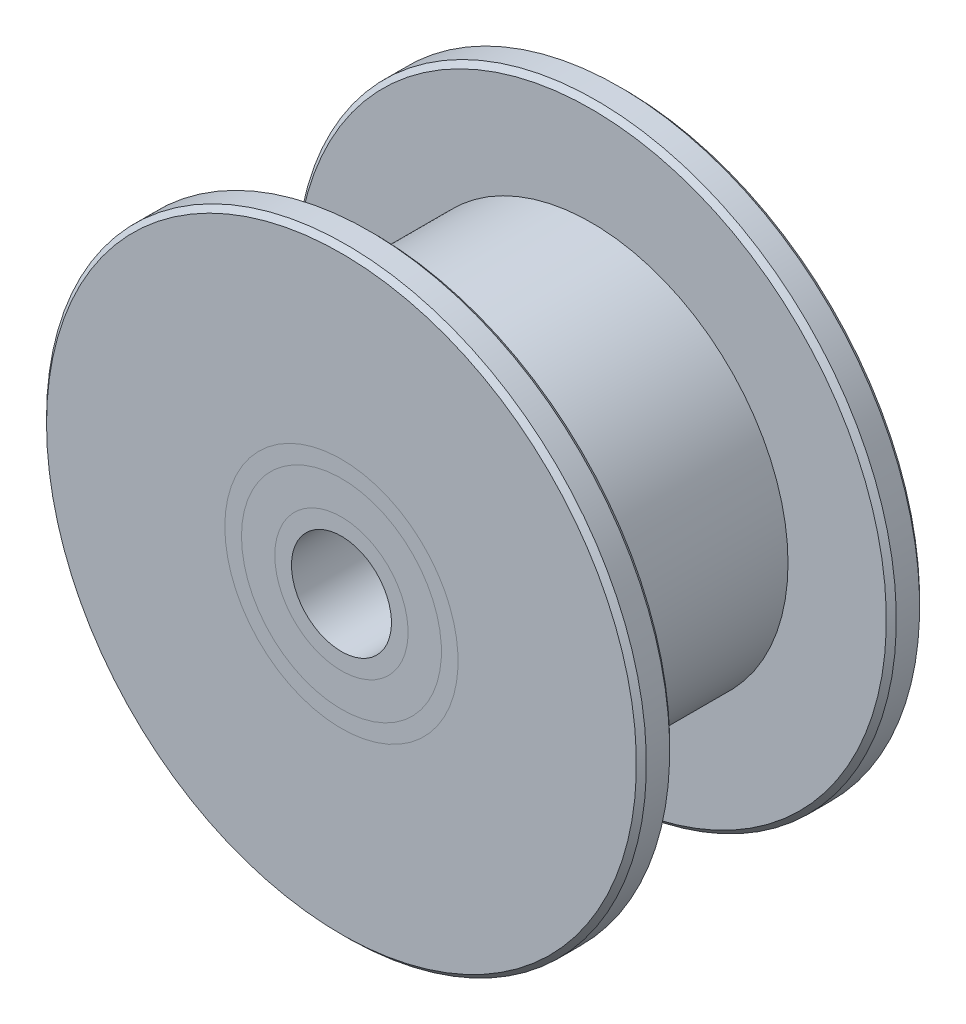
ISO-10303-21;
HEADER;
FILE_DESCRIPTION(('STEP AP214'),'2;1');
FILE_NAME('part.step','',(''),(''),'','','');
FILE_SCHEMA(('AUTOMOTIVE_DESIGN { 1 0 10303 214 1 1 1 1 }'));
ENDSEC;
DATA;
#1=APPLICATION_CONTEXT('core data for automotive mechanical design processes');
#2=APPLICATION_PROTOCOL_DEFINITION('international standard','automotive_design',2000,#1);
#3=PRODUCT_CONTEXT('',#1,'mechanical');
#4=PRODUCT('Part','Part','',(#3));
#5=PRODUCT_RELATED_PRODUCT_CATEGORY('part','',(#4));
#6=PRODUCT_DEFINITION_FORMATION('','',#4);
#7=PRODUCT_DEFINITION_CONTEXT('part definition',#1,'design');
#8=PRODUCT_DEFINITION('design','',#6,#7);
#9=PRODUCT_DEFINITION_SHAPE('','',#8);
#10=(LENGTH_UNIT() NAMED_UNIT(*) SI_UNIT(.MILLI.,.METRE.));
#11=(NAMED_UNIT(*) PLANE_ANGLE_UNIT() SI_UNIT($,.RADIAN.));
#12=(NAMED_UNIT(*) SI_UNIT($,.STERADIAN.) SOLID_ANGLE_UNIT());
#13=UNCERTAINTY_MEASURE_WITH_UNIT(LENGTH_MEASURE(1.E-05),#10,'distance_accuracy_value','');
#14=(GEOMETRIC_REPRESENTATION_CONTEXT(3) GLOBAL_UNCERTAINTY_ASSIGNED_CONTEXT((#13)) GLOBAL_UNIT_ASSIGNED_CONTEXT((#10,
#11,#12)) REPRESENTATION_CONTEXT('',''));
#15=CARTESIAN_POINT('',(0.,0.,0.));
#16=DIRECTION('',(0.,0.,1.));
#17=DIRECTION('',(1.,0.,0.));
#18=AXIS2_PLACEMENT_3D('',#15,#16,#17);
#19=CARTESIAN_POINT('',(0.,0.,0.075));
#20=DIRECTION('',(0.,0.,1.));
#21=DIRECTION('',(1.,0.,0.));
#22=AXIS2_PLACEMENT_3D('',#19,#20,#21);
#23=CONICAL_SURFACE('',#22,8.925,0.785398163397449);
#24=CARTESIAN_POINT('',(0.,0.,0.15));
#25=DIRECTION('',(0.,0.,-1.));
#26=DIRECTION('',(1.,0.,0.));
#27=AXIS2_PLACEMENT_3D('',#24,#25,#26);
#28=CIRCLE('',#27,9.);
#29=CARTESIAN_POINT('',(-9.,0.,0.15));
#30=VERTEX_POINT('',#29);
#31=EDGE_CURVE('P0_E11',#30,#30,#28,.T.);
#32=ORIENTED_EDGE('',*,*,#31,.T.);
#33=DIRECTION('',(0.707106781186548,0.,-0.707106781186547));
#34=VECTOR('',#33,1.);
#35=CARTESIAN_POINT('',(-8.925,0.,0.075));
#36=LINE('',#35,#34);
#37=CARTESIAN_POINT('',(-8.85,0.,0.));
#38=VERTEX_POINT('',#37);
#39=EDGE_CURVE('P0_E27',#30,#38,#36,.T.);
#40=ORIENTED_EDGE('',*,*,#39,.T.);
#41=CARTESIAN_POINT('',(0.,0.,0.));
#42=DIRECTION('',(0.,0.,1.));
#43=DIRECTION('',(1.,0.,0.));
#44=AXIS2_PLACEMENT_3D('',#41,#42,#43);
#45=CIRCLE('',#44,8.85);
#46=EDGE_CURVE('P0_E113',#38,#38,#45,.T.);
#47=ORIENTED_EDGE('',*,*,#46,.T.);
#48=ORIENTED_EDGE('',*,*,#39,.F.);
#49=EDGE_LOOP('',(#32,#40,#47,#48));
#50=FACE_BOUND('',#49,.T.);
#51=ADVANCED_FACE('P0_F16',(#50),#23,.T.);
#52=CARTESIAN_POINT('',(0.,0.,0.));
#53=DIRECTION('',(0.,0.,1.));
#54=DIRECTION('',(1.,0.,0.));
#55=AXIS2_PLACEMENT_3D('',#52,#53,#54);
#56=CYLINDRICAL_SURFACE('',#55,9.);
#57=CARTESIAN_POINT('',(0.,0.,0.85));
#58=DIRECTION('',(0.,0.,1.));
#59=DIRECTION('',(1.,0.,0.));
#60=AXIS2_PLACEMENT_3D('',#57,#58,#59);
#61=CIRCLE('',#60,9.);
#62=CARTESIAN_POINT('',(-9.,0.,0.85));
#63=VERTEX_POINT('',#62);
#64=EDGE_CURVE('P0_E116',#63,#63,#61,.T.);
#65=ORIENTED_EDGE('',*,*,#64,.F.);
#66=DIRECTION('',(0.,0.,-1.));
#67=VECTOR('',#66,1.);
#68=CARTESIAN_POINT('',(-9.,0.,0.));
#69=LINE('',#68,#67);
#70=EDGE_CURVE('P0_E134',#63,#30,#69,.T.);
#71=ORIENTED_EDGE('',*,*,#70,.T.);
#72=ORIENTED_EDGE('',*,*,#31,.F.);
#73=ORIENTED_EDGE('',*,*,#70,.F.);
#74=EDGE_LOOP('',(#65,#71,#72,#73));
#75=FACE_BOUND('',#74,.T.);
#76=ADVANCED_FACE('P0_F181',(#75),#56,.T.);
#77=CARTESIAN_POINT('',(0.,0.,0.));
#78=DIRECTION('',(0.,0.,1.));
#79=DIRECTION('',(1.,0.,0.));
#80=AXIS2_PLACEMENT_3D('',#77,#78,#79);
#81=PLANE('',#80);
#82=ORIENTED_EDGE('',*,*,#46,.F.);
#83=EDGE_LOOP('',(#82));
#84=FACE_BOUND('',#83,.T.);
#85=CARTESIAN_POINT('',(0.,0.,0.));
#86=DIRECTION('',(0.,0.,-1.));
#87=DIRECTION('',(1.,0.,0.));
#88=AXIS2_PLACEMENT_3D('',#85,#86,#87);
#89=CIRCLE('',#88,3.5);
#90=CARTESIAN_POINT('',(-3.5,0.,0.));
#91=VERTEX_POINT('',#90);
#92=EDGE_CURVE('P0_E142',#91,#91,#89,.T.);
#93=ORIENTED_EDGE('',*,*,#92,.F.);
#94=EDGE_LOOP('',(#93));
#95=FACE_BOUND('',#94,.T.);
#96=ADVANCED_FACE('P0_F187',(#84,#95),#81,.F.);
#97=CARTESIAN_POINT('',(0.,0.,0.925));
#98=DIRECTION('',(0.,0.,-1.));
#99=DIRECTION('',(1.,0.,0.));
#100=AXIS2_PLACEMENT_3D('',#97,#98,#99);
#101=CONICAL_SURFACE('',#100,8.925,0.785398163397449);
#102=CARTESIAN_POINT('',(0.,0.,1.));
#103=DIRECTION('',(0.,0.,-1.));
#104=DIRECTION('',(1.,0.,0.));
#105=AXIS2_PLACEMENT_3D('',#102,#103,#104);
#106=CIRCLE('',#105,8.85);
#107=CARTESIAN_POINT('',(-8.85,0.,1.));
#108=VERTEX_POINT('',#107);
#109=EDGE_CURVE('P0_E128',#108,#108,#106,.T.);
#110=ORIENTED_EDGE('',*,*,#109,.T.);
#111=DIRECTION('',(-0.707106781186548,0.,-0.707106781186547));
#112=VECTOR('',#111,1.);
#113=CARTESIAN_POINT('',(-8.925,0.,0.925));
#114=LINE('',#113,#112);
#115=EDGE_CURVE('P0_E120',#108,#63,#114,.T.);
#116=ORIENTED_EDGE('',*,*,#115,.T.);
#117=ORIENTED_EDGE('',*,*,#64,.T.);
#118=ORIENTED_EDGE('',*,*,#115,.F.);
#119=EDGE_LOOP('',(#110,#116,#117,#118));
#120=FACE_BOUND('',#119,.T.);
#121=ADVANCED_FACE('P0_F194',(#120),#101,.T.);
#122=CARTESIAN_POINT('',(0.,0.,1.));
#123=DIRECTION('',(0.,0.,1.));
#124=DIRECTION('',(1.,0.,0.));
#125=AXIS2_PLACEMENT_3D('',#122,#123,#124);
#126=PLANE('',#125);
#127=ORIENTED_EDGE('',*,*,#109,.F.);
#128=EDGE_LOOP('',(#127));
#129=FACE_BOUND('',#128,.T.);
#130=CARTESIAN_POINT('',(0.,0.,1.));
#131=DIRECTION('',(0.,0.,1.));
#132=DIRECTION('',(1.,0.,0.));
#133=AXIS2_PLACEMENT_3D('',#130,#131,#132);
#134=CIRCLE('',#133,5.9);
#135=CARTESIAN_POINT('',(-5.9,0.,1.));
#136=VERTEX_POINT('',#135);
#137=EDGE_CURVE('P0_E74',#136,#136,#134,.T.);
#138=ORIENTED_EDGE('',*,*,#137,.F.);
#139=EDGE_LOOP('',(#138));
#140=FACE_BOUND('',#139,.T.);
#141=ADVANCED_FACE('P0_F197',(#129,#140),#126,.T.);
#142=CARTESIAN_POINT('',(0.,0.,7.575));
#143=DIRECTION('',(0.,0.,1.));
#144=DIRECTION('',(1.,0.,0.));
#145=AXIS2_PLACEMENT_3D('',#142,#143,#144);
#146=CONICAL_SURFACE('',#145,8.925,0.785398163397448);
#147=CARTESIAN_POINT('',(0.,0.,7.5));
#148=DIRECTION('',(0.,0.,1.));
#149=DIRECTION('',(1.,0.,0.));
#150=AXIS2_PLACEMENT_3D('',#147,#148,#149);
#151=CIRCLE('',#150,8.85);
#152=CARTESIAN_POINT('',(-8.85,0.,7.5));
#153=VERTEX_POINT('',#152);
#154=EDGE_CURVE('P0_E82',#153,#153,#151,.T.);
#155=ORIENTED_EDGE('',*,*,#154,.T.);
#156=DIRECTION('',(-0.707106781186548,0.,0.707106781186548));
#157=VECTOR('',#156,1.);
#158=CARTESIAN_POINT('',(-8.925,0.,7.575));
#159=LINE('',#158,#157);
#160=CARTESIAN_POINT('',(-9.,0.,7.65));
#161=VERTEX_POINT('',#160);
#162=EDGE_CURVE('P0_E117',#153,#161,#159,.T.);
#163=ORIENTED_EDGE('',*,*,#162,.T.);
#164=CARTESIAN_POINT('',(0.,0.,7.65));
#165=DIRECTION('',(0.,0.,-1.));
#166=DIRECTION('',(1.,0.,0.));
#167=AXIS2_PLACEMENT_3D('',#164,#165,#166);
#168=CIRCLE('',#167,9.);
#169=EDGE_CURVE('P0_E20',#161,#161,#168,.T.);
#170=ORIENTED_EDGE('',*,*,#169,.T.);
#171=ORIENTED_EDGE('',*,*,#162,.F.);
#172=EDGE_LOOP('',(#155,#163,#170,#171));
#173=FACE_BOUND('',#172,.T.);
#174=ADVANCED_FACE('P0_F18',(#173),#146,.T.);
#175=CARTESIAN_POINT('',(0.,0.,8.5));
#176=DIRECTION('',(0.,0.,-1.));
#177=DIRECTION('',(1.,0.,0.));
#178=AXIS2_PLACEMENT_3D('',#175,#176,#177);
#179=CYLINDRICAL_SURFACE('',#178,9.);
#180=ORIENTED_EDGE('',*,*,#169,.F.);
#181=DIRECTION('',(0.,0.,1.));
#182=VECTOR('',#181,1.);
#183=CARTESIAN_POINT('',(-9.,0.,8.5));
#184=LINE('',#183,#182);
#185=CARTESIAN_POINT('',(-9.,0.,8.35));
#186=VERTEX_POINT('',#185);
#187=EDGE_CURVE('P0_E96',#161,#186,#184,.T.);
#188=ORIENTED_EDGE('',*,*,#187,.T.);
#189=CARTESIAN_POINT('',(0.,0.,8.35));
#190=DIRECTION('',(0.,0.,1.));
#191=DIRECTION('',(1.,0.,0.));
#192=AXIS2_PLACEMENT_3D('',#189,#190,#191);
#193=CIRCLE('',#192,9.);
#194=EDGE_CURVE('P0_E94',#186,#186,#193,.T.);
#195=ORIENTED_EDGE('',*,*,#194,.F.);
#196=ORIENTED_EDGE('',*,*,#187,.F.);
#197=EDGE_LOOP('',(#180,#188,#195,#196));
#198=FACE_BOUND('',#197,.T.);
#199=ADVANCED_FACE('P0_F95',(#198),#179,.T.);
#200=CARTESIAN_POINT('',(0.,0.,7.5));
#201=DIRECTION('',(0.,0.,1.));
#202=DIRECTION('',(1.,0.,0.));
#203=AXIS2_PLACEMENT_3D('',#200,#201,#202);
#204=PLANE('',#203);
#205=ORIENTED_EDGE('',*,*,#154,.F.);
#206=EDGE_LOOP('',(#205));
#207=FACE_BOUND('',#206,.T.);
#208=CARTESIAN_POINT('',(0.,0.,7.5));
#209=DIRECTION('',(0.,0.,-1.));
#210=DIRECTION('',(1.,0.,0.));
#211=AXIS2_PLACEMENT_3D('',#208,#209,#210);
#212=CIRCLE('',#211,5.9);
#213=CARTESIAN_POINT('',(-5.9,0.,7.5));
#214=VERTEX_POINT('',#213);
#215=EDGE_CURVE('P0_E138',#214,#214,#212,.T.);
#216=ORIENTED_EDGE('',*,*,#215,.F.);
#217=EDGE_LOOP('',(#216));
#218=FACE_BOUND('',#217,.T.);
#219=ADVANCED_FACE('P0_F166',(#207,#218),#204,.F.);
#220=CARTESIAN_POINT('',(0.,0.,8.425));
#221=DIRECTION('',(0.,0.,-1.));
#222=DIRECTION('',(1.,0.,0.));
#223=AXIS2_PLACEMENT_3D('',#220,#221,#222);
#224=CONICAL_SURFACE('',#223,8.925,0.785398163397448);
#225=ORIENTED_EDGE('',*,*,#194,.T.);
#226=DIRECTION('',(0.707106781186548,0.,0.707106781186548));
#227=VECTOR('',#226,1.);
#228=CARTESIAN_POINT('',(-8.925,0.,8.425));
#229=LINE('',#228,#227);
#230=CARTESIAN_POINT('',(-8.85,0.,8.5));
#231=VERTEX_POINT('',#230);
#232=EDGE_CURVE('P0_E101',#186,#231,#229,.T.);
#233=ORIENTED_EDGE('',*,*,#232,.T.);
#234=CARTESIAN_POINT('',(0.,0.,8.5));
#235=DIRECTION('',(0.,0.,-1.));
#236=DIRECTION('',(1.,0.,0.));
#237=AXIS2_PLACEMENT_3D('',#234,#235,#236);
#238=CIRCLE('',#237,8.85);
#239=EDGE_CURVE('P0_E109',#231,#231,#238,.T.);
#240=ORIENTED_EDGE('',*,*,#239,.T.);
#241=ORIENTED_EDGE('',*,*,#232,.F.);
#242=EDGE_LOOP('',(#225,#233,#240,#241));
#243=FACE_BOUND('',#242,.T.);
#244=ADVANCED_FACE('P0_F168',(#243),#224,.T.);
#245=CARTESIAN_POINT('',(0.,0.,8.5));
#246=DIRECTION('',(0.,0.,1.));
#247=DIRECTION('',(1.,0.,0.));
#248=AXIS2_PLACEMENT_3D('',#245,#246,#247);
#249=PLANE('',#248);
#250=ORIENTED_EDGE('',*,*,#239,.F.);
#251=EDGE_LOOP('',(#250));
#252=FACE_BOUND('',#251,.T.);
#253=CARTESIAN_POINT('',(0.,0.,8.5));
#254=DIRECTION('',(0.,0.,-1.));
#255=DIRECTION('',(1.,0.,0.));
#256=AXIS2_PLACEMENT_3D('',#253,#254,#255);
#257=CIRCLE('',#256,3.5);
#258=CARTESIAN_POINT('',(-3.5,0.,8.5));
#259=VERTEX_POINT('',#258);
#260=EDGE_CURVE('P0_E149',#259,#259,#257,.T.);
#261=ORIENTED_EDGE('',*,*,#260,.T.);
#262=EDGE_LOOP('',(#261));
#263=FACE_BOUND('',#262,.T.);
#264=ADVANCED_FACE('P0_F176',(#252,#263),#249,.T.);
#265=CARTESIAN_POINT('',(0.,0.,0.));
#266=DIRECTION('',(0.,0.,1.));
#267=DIRECTION('',(1.,0.,0.));
#268=AXIS2_PLACEMENT_3D('',#265,#266,#267);
#269=CYLINDRICAL_SURFACE('',#268,3.5);
#270=ORIENTED_EDGE('',*,*,#260,.F.);
#271=DIRECTION('',(0.,0.,-1.));
#272=VECTOR('',#271,1.);
#273=CARTESIAN_POINT('',(-3.5,0.,0.));
#274=LINE('',#273,#272);
#275=EDGE_CURVE('P0_E137',#259,#91,#274,.T.);
#276=ORIENTED_EDGE('',*,*,#275,.T.);
#277=ORIENTED_EDGE('',*,*,#92,.T.);
#278=ORIENTED_EDGE('',*,*,#275,.F.);
#279=EDGE_LOOP('',(#270,#276,#277,#278));
#280=FACE_BOUND('',#279,.T.);
#281=ADVANCED_FACE('P0_F192',(#280),#269,.F.);
#282=CARTESIAN_POINT('',(0.,0.,0.));
#283=DIRECTION('',(0.,0.,1.));
#284=DIRECTION('',(1.,0.,0.));
#285=AXIS2_PLACEMENT_3D('',#282,#283,#284);
#286=CYLINDRICAL_SURFACE('',#285,5.9);
#287=ORIENTED_EDGE('',*,*,#215,.T.);
#288=DIRECTION('',(0.,0.,-1.));
#289=VECTOR('',#288,1.);
#290=CARTESIAN_POINT('',(-5.9,0.,0.));
#291=LINE('',#290,#289);
#292=EDGE_CURVE('P0_E143',#214,#136,#291,.T.);
#293=ORIENTED_EDGE('',*,*,#292,.T.);
#294=ORIENTED_EDGE('',*,*,#137,.T.);
#295=ORIENTED_EDGE('',*,*,#292,.F.);
#296=EDGE_LOOP('',(#287,#293,#294,#295));
#297=FACE_BOUND('',#296,.T.);
#298=ADVANCED_FACE('P0_F164',(#297),#286,.T.);
#299=CLOSED_SHELL('',(#51,#76,#96,#121,#141,#174,#199,#219,#244,#264,#281,#298));
#300=MANIFOLD_SOLID_BREP('P0_B1',#299);
#301=CARTESIAN_POINT('',(0.,0.,0.));
#302=DIRECTION('',(0.,0.,1.));
#303=DIRECTION('',(1.,0.,0.));
#304=AXIS2_PLACEMENT_3D('',#301,#302,#303);
#305=CYLINDRICAL_SURFACE('',#304,3.);
#306=CARTESIAN_POINT('',(0.,0.,8.5));
#307=DIRECTION('',(0.,0.,1.));
#308=DIRECTION('',(1.,0.,0.));
#309=AXIS2_PLACEMENT_3D('',#306,#307,#308);
#310=CIRCLE('',#309,3.);
#311=CARTESIAN_POINT('',(-3.,0.,8.5));
#312=VERTEX_POINT('',#311);
#313=EDGE_CURVE('P1_E11',#312,#312,#310,.T.);
#314=ORIENTED_EDGE('',*,*,#313,.T.);
#315=DIRECTION('',(0.,0.,-1.));
#316=VECTOR('',#315,1.);
#317=CARTESIAN_POINT('',(-3.,0.,0.));
#318=LINE('',#317,#316);
#319=CARTESIAN_POINT('',(-3.,0.,0.));
#320=VERTEX_POINT('',#319);
#321=EDGE_CURVE('P1_E26',#312,#320,#318,.T.);
#322=ORIENTED_EDGE('',*,*,#321,.T.);
#323=CARTESIAN_POINT('',(0.,0.,0.));
#324=DIRECTION('',(0.,0.,-1.));
#325=DIRECTION('',(1.,0.,0.));
#326=AXIS2_PLACEMENT_3D('',#323,#324,#325);
#327=CIRCLE('',#326,3.);
#328=EDGE_CURVE('P1_E19',#320,#320,#327,.T.);
#329=ORIENTED_EDGE('',*,*,#328,.T.);
#330=ORIENTED_EDGE('',*,*,#321,.F.);
#331=EDGE_LOOP('',(#314,#322,#329,#330));
#332=FACE_BOUND('',#331,.T.);
#333=ADVANCED_FACE('P1_F16',(#332),#305,.F.);
#334=CARTESIAN_POINT('',(0.,0.,0.));
#335=DIRECTION('',(0.,0.,1.));
#336=DIRECTION('',(1.,0.,0.));
#337=AXIS2_PLACEMENT_3D('',#334,#335,#336);
#338=CYLINDRICAL_SURFACE('',#337,3.5);
#339=CARTESIAN_POINT('',(0.,0.,8.5));
#340=DIRECTION('',(0.,0.,-1.));
#341=DIRECTION('',(1.,0.,0.));
#342=AXIS2_PLACEMENT_3D('',#339,#340,#341);
#343=CIRCLE('',#342,3.5);
#344=CARTESIAN_POINT('',(-3.5,0.,8.5));
#345=VERTEX_POINT('',#344);
#346=EDGE_CURVE('P1_E53',#345,#345,#343,.T.);
#347=ORIENTED_EDGE('',*,*,#346,.T.);
#348=DIRECTION('',(0.,0.,-1.));
#349=VECTOR('',#348,1.);
#350=CARTESIAN_POINT('',(-3.5,0.,0.));
#351=LINE('',#350,#349);
#352=CARTESIAN_POINT('',(-3.5,0.,0.));
#353=VERTEX_POINT('',#352);
#354=EDGE_CURVE('P1_E58',#345,#353,#351,.T.);
#355=ORIENTED_EDGE('',*,*,#354,.T.);
#356=CARTESIAN_POINT('',(0.,0.,0.));
#357=DIRECTION('',(0.,0.,1.));
#358=DIRECTION('',(1.,0.,0.));
#359=AXIS2_PLACEMENT_3D('',#356,#357,#358);
#360=CIRCLE('',#359,3.5);
#361=EDGE_CURVE('P1_E46',#353,#353,#360,.T.);
#362=ORIENTED_EDGE('',*,*,#361,.T.);
#363=ORIENTED_EDGE('',*,*,#354,.F.);
#364=EDGE_LOOP('',(#347,#355,#362,#363));
#365=FACE_BOUND('',#364,.T.);
#366=ADVANCED_FACE('P1_F77',(#365),#338,.T.);
#367=CARTESIAN_POINT('',(0.,0.,0.));
#368=DIRECTION('',(0.,0.,1.));
#369=DIRECTION('',(1.,0.,0.));
#370=AXIS2_PLACEMENT_3D('',#367,#368,#369);
#371=PLANE('',#370);
#372=ORIENTED_EDGE('',*,*,#361,.F.);
#373=EDGE_LOOP('',(#372));
#374=FACE_BOUND('',#373,.T.);
#375=ORIENTED_EDGE('',*,*,#328,.F.);
#376=EDGE_LOOP('',(#375));
#377=FACE_BOUND('',#376,.T.);
#378=ADVANCED_FACE('P1_F75',(#374,#377),#371,.F.);
#379=CARTESIAN_POINT('',(0.,0.,8.5));
#380=DIRECTION('',(0.,0.,1.));
#381=DIRECTION('',(1.,0.,0.));
#382=AXIS2_PLACEMENT_3D('',#379,#380,#381);
#383=PLANE('',#382);
#384=ORIENTED_EDGE('',*,*,#346,.F.);
#385=EDGE_LOOP('',(#384));
#386=FACE_BOUND('',#385,.T.);
#387=ORIENTED_EDGE('',*,*,#313,.F.);
#388=EDGE_LOOP('',(#387));
#389=FACE_BOUND('',#388,.T.);
#390=ADVANCED_FACE('P1_F54',(#386,#389),#383,.T.);
#391=CLOSED_SHELL('',(#333,#366,#378,#390));
#392=MANIFOLD_SOLID_BREP('P1_B1',#391);
#393=CARTESIAN_POINT('',(0.,0.,0.));
#394=DIRECTION('',(0.,0.,1.));
#395=DIRECTION('',(1.,0.,0.));
#396=AXIS2_PLACEMENT_3D('',#393,#394,#395);
#397=CYLINDRICAL_SURFACE('',#396,1.5);
#398=CARTESIAN_POINT('',(0.,0.,8.5));
#399=DIRECTION('',(0.,0.,1.));
#400=DIRECTION('',(1.,0.,0.));
#401=AXIS2_PLACEMENT_3D('',#398,#399,#400);
#402=CIRCLE('',#401,1.5);
#403=CARTESIAN_POINT('',(-1.5,0.,8.5));
#404=VERTEX_POINT('',#403);
#405=EDGE_CURVE('P2_E11',#404,#404,#402,.T.);
#406=ORIENTED_EDGE('',*,*,#405,.T.);
#407=DIRECTION('',(0.,0.,-1.));
#408=VECTOR('',#407,1.);
#409=CARTESIAN_POINT('',(-1.5,0.,0.));
#410=LINE('',#409,#408);
#411=CARTESIAN_POINT('',(-1.5,0.,0.));
#412=VERTEX_POINT('',#411);
#413=EDGE_CURVE('P2_E20',#404,#412,#410,.T.);
#414=ORIENTED_EDGE('',*,*,#413,.T.);
#415=CARTESIAN_POINT('',(0.,0.,0.));
#416=DIRECTION('',(0.,0.,-1.));
#417=DIRECTION('',(1.,0.,0.));
#418=AXIS2_PLACEMENT_3D('',#415,#416,#417);
#419=CIRCLE('',#418,1.5);
#420=EDGE_CURVE('P2_E63',#412,#412,#419,.T.);
#421=ORIENTED_EDGE('',*,*,#420,.T.);
#422=ORIENTED_EDGE('',*,*,#413,.F.);
#423=EDGE_LOOP('',(#406,#414,#421,#422));
#424=FACE_BOUND('',#423,.T.);
#425=ADVANCED_FACE('P2_F16',(#424),#397,.F.);
#426=CARTESIAN_POINT('',(0.,0.,0.));
#427=DIRECTION('',(0.,0.,1.));
#428=DIRECTION('',(1.,0.,0.));
#429=AXIS2_PLACEMENT_3D('',#426,#427,#428);
#430=CYLINDRICAL_SURFACE('',#429,2.);
#431=CARTESIAN_POINT('',(0.,0.,8.5));
#432=DIRECTION('',(0.,0.,-1.));
#433=DIRECTION('',(1.,0.,0.));
#434=AXIS2_PLACEMENT_3D('',#431,#432,#433);
#435=CIRCLE('',#434,2.);
#436=CARTESIAN_POINT('',(-2.,0.,8.5));
#437=VERTEX_POINT('',#436);
#438=EDGE_CURVE('P2_E57',#437,#437,#435,.T.);
#439=ORIENTED_EDGE('',*,*,#438,.T.);
#440=DIRECTION('',(0.,0.,-1.));
#441=VECTOR('',#440,1.);
#442=CARTESIAN_POINT('',(-2.,0.,0.));
#443=LINE('',#442,#441);
#444=CARTESIAN_POINT('',(-2.,0.,0.));
#445=VERTEX_POINT('',#444);
#446=EDGE_CURVE('P2_E53',#437,#445,#443,.T.);
#447=ORIENTED_EDGE('',*,*,#446,.T.);
#448=CARTESIAN_POINT('',(0.,0.,0.));
#449=DIRECTION('',(0.,0.,1.));
#450=DIRECTION('',(1.,0.,0.));
#451=AXIS2_PLACEMENT_3D('',#448,#449,#450);
#452=CIRCLE('',#451,2.);
#453=EDGE_CURVE('P2_E47',#445,#445,#452,.T.);
#454=ORIENTED_EDGE('',*,*,#453,.T.);
#455=ORIENTED_EDGE('',*,*,#446,.F.);
#456=EDGE_LOOP('',(#439,#447,#454,#455));
#457=FACE_BOUND('',#456,.T.);
#458=ADVANCED_FACE('P2_F56',(#457),#430,.T.);
#459=CARTESIAN_POINT('',(0.,0.,0.));
#460=DIRECTION('',(0.,0.,1.));
#461=DIRECTION('',(1.,0.,0.));
#462=AXIS2_PLACEMENT_3D('',#459,#460,#461);
#463=PLANE('',#462);
#464=ORIENTED_EDGE('',*,*,#453,.F.);
#465=EDGE_LOOP('',(#464));
#466=FACE_BOUND('',#465,.T.);
#467=ORIENTED_EDGE('',*,*,#420,.F.);
#468=EDGE_LOOP('',(#467));
#469=FACE_BOUND('',#468,.T.);
#470=ADVANCED_FACE('P2_F18',(#466,#469),#463,.F.);
#471=CARTESIAN_POINT('',(0.,0.,8.5));
#472=DIRECTION('',(0.,0.,1.));
#473=DIRECTION('',(1.,0.,0.));
#474=AXIS2_PLACEMENT_3D('',#471,#472,#473);
#475=PLANE('',#474);
#476=ORIENTED_EDGE('',*,*,#438,.F.);
#477=EDGE_LOOP('',(#476));
#478=FACE_BOUND('',#477,.T.);
#479=ORIENTED_EDGE('',*,*,#405,.F.);
#480=EDGE_LOOP('',(#479));
#481=FACE_BOUND('',#480,.T.);
#482=ADVANCED_FACE('P2_F84',(#478,#481),#475,.T.);
#483=CLOSED_SHELL('',(#425,#458,#470,#482));
#484=MANIFOLD_SOLID_BREP('P2_B1',#483);
#485=CARTESIAN_POINT('',(0.,0.,0.));
#486=DIRECTION('',(0.,0.,1.));
#487=DIRECTION('',(1.,0.,0.));
#488=AXIS2_PLACEMENT_3D('',#485,#486,#487);
#489=CYLINDRICAL_SURFACE('',#488,2.);
#490=CARTESIAN_POINT('',(0.,0.,8.5));
#491=DIRECTION('',(0.,0.,1.));
#492=DIRECTION('',(1.,0.,0.));
#493=AXIS2_PLACEMENT_3D('',#490,#491,#492);
#494=CIRCLE('',#493,2.);
#495=CARTESIAN_POINT('',(-2.,0.,8.5));
#496=VERTEX_POINT('',#495);
#497=EDGE_CURVE('P3_E11',#496,#496,#494,.T.);
#498=ORIENTED_EDGE('',*,*,#497,.T.);
#499=DIRECTION('',(0.,0.,-1.));
#500=VECTOR('',#499,1.);
#501=CARTESIAN_POINT('',(-2.,0.,0.));
#502=LINE('',#501,#500);
#503=CARTESIAN_POINT('',(-2.,0.,0.));
#504=VERTEX_POINT('',#503);
#505=EDGE_CURVE('P3_E27',#496,#504,#502,.T.);
#506=ORIENTED_EDGE('',*,*,#505,.T.);
#507=CARTESIAN_POINT('',(0.,0.,0.));
#508=DIRECTION('',(0.,0.,-1.));
#509=DIRECTION('',(1.,0.,0.));
#510=AXIS2_PLACEMENT_3D('',#507,#508,#509);
#511=CIRCLE('',#510,2.);
#512=EDGE_CURVE('P3_E57',#504,#504,#511,.T.);
#513=ORIENTED_EDGE('',*,*,#512,.T.);
#514=ORIENTED_EDGE('',*,*,#505,.F.);
#515=EDGE_LOOP('',(#498,#506,#513,#514));
#516=FACE_BOUND('',#515,.T.);
#517=ADVANCED_FACE('P3_F16',(#516),#489,.F.);
#518=CARTESIAN_POINT('',(0.,0.,0.));
#519=DIRECTION('',(0.,0.,1.));
#520=DIRECTION('',(1.,0.,0.));
#521=AXIS2_PLACEMENT_3D('',#518,#519,#520);
#522=CYLINDRICAL_SURFACE('',#521,3.);
#523=CARTESIAN_POINT('',(0.,0.,8.5));
#524=DIRECTION('',(0.,0.,-1.));
#525=DIRECTION('',(1.,0.,0.));
#526=AXIS2_PLACEMENT_3D('',#523,#524,#525);
#527=CIRCLE('',#526,3.);
#528=CARTESIAN_POINT('',(-3.,0.,8.5));
#529=VERTEX_POINT('',#528);
#530=EDGE_CURVE('P3_E53',#529,#529,#527,.T.);
#531=ORIENTED_EDGE('',*,*,#530,.T.);
#532=DIRECTION('',(0.,0.,-1.));
#533=VECTOR('',#532,1.);
#534=CARTESIAN_POINT('',(-3.,0.,0.));
#535=LINE('',#534,#533);
#536=CARTESIAN_POINT('',(-3.,0.,0.));
#537=VERTEX_POINT('',#536);
#538=EDGE_CURVE('P3_E58',#529,#537,#535,.T.);
#539=ORIENTED_EDGE('',*,*,#538,.T.);
#540=CARTESIAN_POINT('',(0.,0.,0.));
#541=DIRECTION('',(0.,0.,1.));
#542=DIRECTION('',(1.,0.,0.));
#543=AXIS2_PLACEMENT_3D('',#540,#541,#542);
#544=CIRCLE('',#543,3.);
#545=EDGE_CURVE('P3_E20',#537,#537,#544,.T.);
#546=ORIENTED_EDGE('',*,*,#545,.T.);
#547=ORIENTED_EDGE('',*,*,#538,.F.);
#548=EDGE_LOOP('',(#531,#539,#546,#547));
#549=FACE_BOUND('',#548,.T.);
#550=ADVANCED_FACE('P3_F77',(#549),#522,.T.);
#551=CARTESIAN_POINT('',(0.,0.,0.));
#552=DIRECTION('',(0.,0.,1.));
#553=DIRECTION('',(1.,0.,0.));
#554=AXIS2_PLACEMENT_3D('',#551,#552,#553);
#555=PLANE('',#554);
#556=ORIENTED_EDGE('',*,*,#545,.F.);
#557=EDGE_LOOP('',(#556));
#558=FACE_BOUND('',#557,.T.);
#559=ORIENTED_EDGE('',*,*,#512,.F.);
#560=EDGE_LOOP('',(#559));
#561=FACE_BOUND('',#560,.T.);
#562=ADVANCED_FACE('P3_F75',(#558,#561),#555,.F.);
#563=CARTESIAN_POINT('',(0.,0.,8.5));
#564=DIRECTION('',(0.,0.,1.));
#565=DIRECTION('',(1.,0.,0.));
#566=AXIS2_PLACEMENT_3D('',#563,#564,#565);
#567=PLANE('',#566);
#568=ORIENTED_EDGE('',*,*,#530,.F.);
#569=EDGE_LOOP('',(#568));
#570=FACE_BOUND('',#569,.T.);
#571=ORIENTED_EDGE('',*,*,#497,.F.);
#572=EDGE_LOOP('',(#571));
#573=FACE_BOUND('',#572,.T.);
#574=ADVANCED_FACE('P3_F18',(#570,#573),#567,.T.);
#575=CLOSED_SHELL('',(#517,#550,#562,#574));
#576=MANIFOLD_SOLID_BREP('P3_B1',#575);
#577=ADVANCED_BREP_SHAPE_REPRESENTATION('',(#18,#300,#392,#484,#576),#14);
#578=SHAPE_DEFINITION_REPRESENTATION(#9,#577);
ENDSEC;
END-ISO-10303-21;
